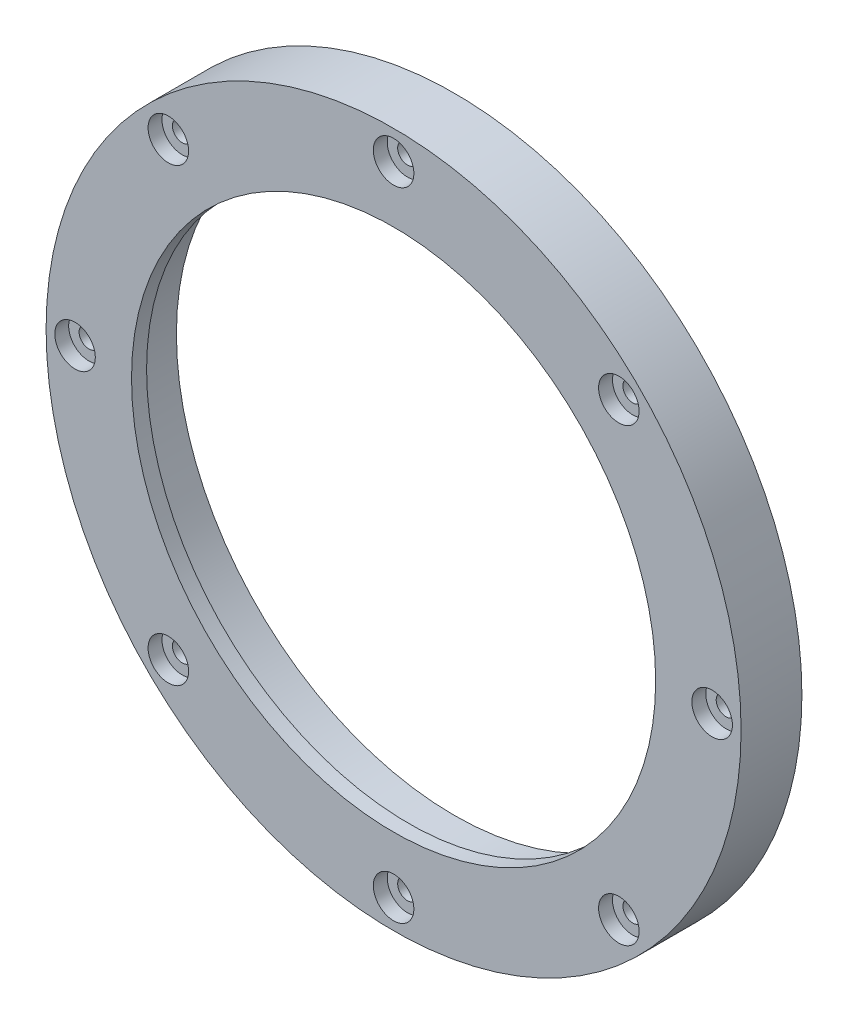
ISO-10303-21;
HEADER;
FILE_DESCRIPTION(('STEP AP214'),'2;1');
FILE_NAME('part.step','',(''),(''),'','','');
FILE_SCHEMA(('AUTOMOTIVE_DESIGN { 1 0 10303 214 1 1 1 1 }'));
ENDSEC;
DATA;
#1=APPLICATION_CONTEXT('core data for automotive mechanical design processes');
#2=APPLICATION_PROTOCOL_DEFINITION('international standard','automotive_design',2000,#1);
#3=PRODUCT_CONTEXT('',#1,'mechanical');
#4=PRODUCT('Part','Part','',(#3));
#5=PRODUCT_RELATED_PRODUCT_CATEGORY('part','',(#4));
#6=PRODUCT_DEFINITION_FORMATION('','',#4);
#7=PRODUCT_DEFINITION_CONTEXT('part definition',#1,'design');
#8=PRODUCT_DEFINITION('design','',#6,#7);
#9=PRODUCT_DEFINITION_SHAPE('','',#8);
#10=(LENGTH_UNIT() NAMED_UNIT(*) SI_UNIT(.MILLI.,.METRE.));
#11=(NAMED_UNIT(*) PLANE_ANGLE_UNIT() SI_UNIT($,.RADIAN.));
#12=(NAMED_UNIT(*) SI_UNIT($,.STERADIAN.) SOLID_ANGLE_UNIT());
#13=UNCERTAINTY_MEASURE_WITH_UNIT(LENGTH_MEASURE(1.E-05),#10,'distance_accuracy_value','');
#14=(GEOMETRIC_REPRESENTATION_CONTEXT(3) GLOBAL_UNCERTAINTY_ASSIGNED_CONTEXT((#13)) GLOBAL_UNIT_ASSIGNED_CONTEXT((#10,
#11,#12)) REPRESENTATION_CONTEXT('',''));
#15=CARTESIAN_POINT('',(0.,0.,0.));
#16=DIRECTION('',(0.,0.,1.));
#17=DIRECTION('',(1.,0.,0.));
#18=AXIS2_PLACEMENT_3D('',#15,#16,#17);
#19=CARTESIAN_POINT('',(0.,0.,70.4));
#20=DIRECTION('',(0.,0.,1.));
#21=DIRECTION('',(1.,0.,0.));
#22=AXIS2_PLACEMENT_3D('',#19,#20,#21);
#23=PLANE('',#22);
#24=CARTESIAN_POINT('',(0.,0.,70.4));
#25=DIRECTION('',(0.,0.,1.));
#26=DIRECTION('',(1.,0.,0.));
#27=AXIS2_PLACEMENT_3D('',#24,#25,#26);
#28=CIRCLE('',#27,48.);
#29=CARTESIAN_POINT('',(48.,0.,70.4));
#30=VERTEX_POINT('',#29);
#31=EDGE_CURVE('E150',#30,#30,#28,.T.);
#32=ORIENTED_EDGE('',*,*,#31,.F.);
#33=EDGE_LOOP('',(#32));
#34=FACE_BOUND('',#33,.T.);
#35=CARTESIAN_POINT('',(0.,0.,70.4));
#36=DIRECTION('',(0.,0.,1.));
#37=DIRECTION('',(1.,0.,0.));
#38=AXIS2_PLACEMENT_3D('',#35,#36,#37);
#39=CIRCLE('',#38,45.25);
#40=CARTESIAN_POINT('',(-45.25,0.,70.4));
#41=VERTEX_POINT('',#40);
#42=EDGE_CURVE('E11',#41,#41,#39,.T.);
#43=ORIENTED_EDGE('',*,*,#42,.T.);
#44=EDGE_LOOP('',(#43));
#45=FACE_BOUND('',#44,.T.);
#46=ADVANCED_FACE('F34',(#34,#45),#23,.F.);
#47=CARTESIAN_POINT('',(0.,0.,73.));
#48=DIRECTION('',(0.,0.,1.));
#49=DIRECTION('',(1.,0.,0.));
#50=AXIS2_PLACEMENT_3D('',#47,#48,#49);
#51=PLANE('',#50);
#52=CARTESIAN_POINT('',(0.,55.,73.));
#53=DIRECTION('',(0.,0.,1.));
#54=DIRECTION('',(1.,0.,0.));
#55=AXIS2_PLACEMENT_3D('',#52,#53,#54);
#56=CIRCLE('',#55,3.5);
#57=CARTESIAN_POINT('',(3.5,55.,73.));
#58=VERTEX_POINT('',#57);
#59=EDGE_CURVE('E285',#58,#58,#56,.T.);
#60=ORIENTED_EDGE('',*,*,#59,.F.);
#61=EDGE_LOOP('',(#60));
#62=FACE_BOUND('',#61,.T.);
#63=CARTESIAN_POINT('',(38.8908729652608,38.8908729652618,73.));
#64=DIRECTION('',(0.,0.,1.));
#65=DIRECTION('',(1.,0.,0.));
#66=AXIS2_PLACEMENT_3D('',#63,#64,#65);
#67=CIRCLE('',#66,3.5);
#68=CARTESIAN_POINT('',(42.3908729652608,38.8908729652618,73.));
#69=VERTEX_POINT('',#68);
#70=EDGE_CURVE('E104',#69,#69,#67,.T.);
#71=ORIENTED_EDGE('',*,*,#70,.F.);
#72=EDGE_LOOP('',(#71));
#73=FACE_BOUND('',#72,.T.);
#74=CARTESIAN_POINT('',(55.0000000000023,2.33468769191537E-12,73.));
#75=DIRECTION('',(0.,0.,1.));
#76=DIRECTION('',(1.,0.,0.));
#77=AXIS2_PLACEMENT_3D('',#74,#75,#76);
#78=CIRCLE('',#77,3.5);
#79=CARTESIAN_POINT('',(58.5000000000023,2.33468769191537E-12,73.));
#80=VERTEX_POINT('',#79);
#81=EDGE_CURVE('E91',#80,#80,#78,.T.);
#82=ORIENTED_EDGE('',*,*,#81,.F.);
#83=EDGE_LOOP('',(#82));
#84=FACE_BOUND('',#83,.T.);
#85=CARTESIAN_POINT('',(38.8908729652641,-38.8908729652585,73.));
#86=DIRECTION('',(0.,0.,1.));
#87=DIRECTION('',(1.,0.,0.));
#88=AXIS2_PLACEMENT_3D('',#85,#86,#87);
#89=CIRCLE('',#88,3.5);
#90=CARTESIAN_POINT('',(42.3908729652641,-38.8908729652585,73.));
#91=VERTEX_POINT('',#90);
#92=EDGE_CURVE('E87',#91,#91,#89,.T.);
#93=ORIENTED_EDGE('',*,*,#92,.F.);
#94=EDGE_LOOP('',(#93));
#95=FACE_BOUND('',#94,.T.);
#96=CARTESIAN_POINT('',(4.66937538383073E-12,-55.,73.));
#97=DIRECTION('',(0.,0.,1.));
#98=DIRECTION('',(1.,0.,0.));
#99=AXIS2_PLACEMENT_3D('',#96,#97,#98);
#100=CIRCLE('',#99,3.5);
#101=CARTESIAN_POINT('',(3.50000000000467,-55.,73.));
#102=VERTEX_POINT('',#101);
#103=EDGE_CURVE('E83',#102,#102,#100,.T.);
#104=ORIENTED_EDGE('',*,*,#103,.F.);
#105=EDGE_LOOP('',(#104));
#106=FACE_BOUND('',#105,.T.);
#107=CARTESIAN_POINT('',(-38.8908729652561,-38.8908729652618,73.));
#108=DIRECTION('',(0.,0.,1.));
#109=DIRECTION('',(1.,0.,0.));
#110=AXIS2_PLACEMENT_3D('',#107,#108,#109);
#111=CIRCLE('',#110,3.5);
#112=CARTESIAN_POINT('',(-35.3908729652561,-38.8908729652618,73.));
#113=VERTEX_POINT('',#112);
#114=EDGE_CURVE('E78',#113,#113,#111,.T.);
#115=ORIENTED_EDGE('',*,*,#114,.F.);
#116=EDGE_LOOP('',(#115));
#117=FACE_BOUND('',#116,.T.);
#118=CARTESIAN_POINT('',(-54.9999999999977,-2.34142324931068E-12,73.));
#119=DIRECTION('',(0.,0.,1.));
#120=DIRECTION('',(1.,0.,0.));
#121=AXIS2_PLACEMENT_3D('',#118,#119,#120);
#122=CIRCLE('',#121,3.5);
#123=CARTESIAN_POINT('',(-51.4999999999977,-2.34142324931068E-12,73.));
#124=VERTEX_POINT('',#123);
#125=EDGE_CURVE('E73',#124,#124,#122,.T.);
#126=ORIENTED_EDGE('',*,*,#125,.F.);
#127=EDGE_LOOP('',(#126));
#128=FACE_BOUND('',#127,.T.);
#129=CARTESIAN_POINT('',(-38.8908729652594,38.8908729652585,73.));
#130=DIRECTION('',(0.,0.,1.));
#131=DIRECTION('',(1.,0.,0.));
#132=AXIS2_PLACEMENT_3D('',#129,#130,#131);
#133=CIRCLE('',#132,3.5);
#134=CARTESIAN_POINT('',(-35.3908729652594,38.8908729652585,73.));
#135=VERTEX_POINT('',#134);
#136=EDGE_CURVE('E68',#135,#135,#133,.T.);
#137=ORIENTED_EDGE('',*,*,#136,.F.);
#138=EDGE_LOOP('',(#137));
#139=FACE_BOUND('',#138,.T.);
#140=CARTESIAN_POINT('',(0.,0.,73.));
#141=DIRECTION('',(0.,0.,1.));
#142=DIRECTION('',(1.,0.,0.));
#143=AXIS2_PLACEMENT_3D('',#140,#141,#142);
#144=CIRCLE('',#143,60.);
#145=CARTESIAN_POINT('',(60.,0.,73.));
#146=VERTEX_POINT('',#145);
#147=EDGE_CURVE('E63',#146,#146,#144,.F.);
#148=ORIENTED_EDGE('',*,*,#147,.F.);
#149=EDGE_LOOP('',(#148));
#150=FACE_BOUND('',#149,.T.);
#151=CARTESIAN_POINT('',(0.,0.,73.));
#152=DIRECTION('',(0.,0.,-1.));
#153=DIRECTION('',(1.,0.,0.));
#154=AXIS2_PLACEMENT_3D('',#151,#152,#153);
#155=CIRCLE('',#154,45.25);
#156=CARTESIAN_POINT('',(-45.25,0.,73.));
#157=VERTEX_POINT('',#156);
#158=EDGE_CURVE('E44',#157,#157,#155,.T.);
#159=ORIENTED_EDGE('',*,*,#158,.T.);
#160=EDGE_LOOP('',(#159));
#161=FACE_BOUND('',#160,.T.);
#162=ADVANCED_FACE('F172',(#62,#73,#84,#95,#106,#117,#128,#139,#150,#161),#51,.T.);
#163=CARTESIAN_POINT('',(0.,0.,70.5));
#164=DIRECTION('',(0.,0.,1.));
#165=DIRECTION('',(1.,0.,0.));
#166=AXIS2_PLACEMENT_3D('',#163,#164,#165);
#167=CYLINDRICAL_SURFACE('',#166,45.25);
#168=ORIENTED_EDGE('',*,*,#42,.F.);
#169=DIRECTION('',(0.,0.,1.));
#170=VECTOR('',#169,1.);
#171=CARTESIAN_POINT('',(-45.25,0.,70.5));
#172=LINE('',#171,#170);
#173=EDGE_CURVE('E53',#41,#157,#172,.T.);
#174=ORIENTED_EDGE('',*,*,#173,.T.);
#175=ORIENTED_EDGE('',*,*,#158,.F.);
#176=ORIENTED_EDGE('',*,*,#173,.F.);
#177=EDGE_LOOP('',(#168,#174,#175,#176));
#178=FACE_BOUND('',#177,.T.);
#179=ADVANCED_FACE('F52',(#178),#167,.F.);
#180=CARTESIAN_POINT('',(0.,0.,62.5));
#181=DIRECTION('',(0.,0.,1.));
#182=DIRECTION('',(1.,0.,0.));
#183=AXIS2_PLACEMENT_3D('',#180,#181,#182);
#184=CYLINDRICAL_SURFACE('',#183,48.);
#185=ORIENTED_EDGE('',*,*,#31,.T.);
#186=EDGE_LOOP('',(#185));
#187=FACE_BOUND('',#186,.T.);
#188=CARTESIAN_POINT('',(0.,0.,62.5));
#189=DIRECTION('',(0.,0.,-1.));
#190=DIRECTION('',(1.,0.,0.));
#191=AXIS2_PLACEMENT_3D('',#188,#189,#190);
#192=CIRCLE('',#191,48.);
#193=CARTESIAN_POINT('',(48.,0.,62.5));
#194=VERTEX_POINT('',#193);
#195=EDGE_CURVE('E56',#194,#194,#192,.T.);
#196=ORIENTED_EDGE('',*,*,#195,.T.);
#197=EDGE_LOOP('',(#196));
#198=FACE_BOUND('',#197,.T.);
#199=ADVANCED_FACE('F36',(#187,#198),#184,.F.);
#200=CARTESIAN_POINT('',(0.,0.,62.5));
#201=DIRECTION('',(0.,0.,1.));
#202=DIRECTION('',(1.,0.,0.));
#203=AXIS2_PLACEMENT_3D('',#200,#201,#202);
#204=PLANE('',#203);
#205=CARTESIAN_POINT('',(0.,55.,62.5));
#206=DIRECTION('',(0.,0.,1.));
#207=DIRECTION('',(1.,0.,0.));
#208=AXIS2_PLACEMENT_3D('',#205,#206,#207);
#209=CIRCLE('',#208,1.69999999999999);
#210=CARTESIAN_POINT('',(1.69999999999999,55.,62.5));
#211=VERTEX_POINT('',#210);
#212=EDGE_CURVE('E38',#211,#211,#209,.T.);
#213=ORIENTED_EDGE('',*,*,#212,.T.);
#214=EDGE_LOOP('',(#213));
#215=FACE_BOUND('',#214,.T.);
#216=CARTESIAN_POINT('',(38.8908729652608,38.8908729652618,62.5));
#217=DIRECTION('',(0.,0.,1.));
#218=DIRECTION('',(1.,0.,0.));
#219=AXIS2_PLACEMENT_3D('',#216,#217,#218);
#220=CIRCLE('',#219,1.69999999999999);
#221=CARTESIAN_POINT('',(40.5908729652608,38.8908729652618,62.5));
#222=VERTEX_POINT('',#221);
#223=EDGE_CURVE('E89',#222,#222,#220,.T.);
#224=ORIENTED_EDGE('',*,*,#223,.T.);
#225=EDGE_LOOP('',(#224));
#226=FACE_BOUND('',#225,.T.);
#227=CARTESIAN_POINT('',(55.0000000000023,2.33468769191537E-12,62.5));
#228=DIRECTION('',(0.,0.,1.));
#229=DIRECTION('',(1.,0.,0.));
#230=AXIS2_PLACEMENT_3D('',#227,#228,#229);
#231=CIRCLE('',#230,1.69999999999999);
#232=CARTESIAN_POINT('',(56.7000000000023,2.33468769191537E-12,62.5));
#233=VERTEX_POINT('',#232);
#234=EDGE_CURVE('E85',#233,#233,#231,.T.);
#235=ORIENTED_EDGE('',*,*,#234,.T.);
#236=EDGE_LOOP('',(#235));
#237=FACE_BOUND('',#236,.T.);
#238=CARTESIAN_POINT('',(38.8908729652641,-38.8908729652585,62.5));
#239=DIRECTION('',(0.,0.,1.));
#240=DIRECTION('',(1.,0.,0.));
#241=AXIS2_PLACEMENT_3D('',#238,#239,#240);
#242=CIRCLE('',#241,1.69999999999999);
#243=CARTESIAN_POINT('',(40.5908729652641,-38.8908729652585,62.5));
#244=VERTEX_POINT('',#243);
#245=EDGE_CURVE('E80',#244,#244,#242,.T.);
#246=ORIENTED_EDGE('',*,*,#245,.T.);
#247=EDGE_LOOP('',(#246));
#248=FACE_BOUND('',#247,.T.);
#249=CARTESIAN_POINT('',(4.66937538383073E-12,-55.,62.5));
#250=DIRECTION('',(0.,0.,1.));
#251=DIRECTION('',(1.,0.,0.));
#252=AXIS2_PLACEMENT_3D('',#249,#250,#251);
#253=CIRCLE('',#252,1.69999999999999);
#254=CARTESIAN_POINT('',(1.70000000000466,-55.,62.5));
#255=VERTEX_POINT('',#254);
#256=EDGE_CURVE('E75',#255,#255,#253,.T.);
#257=ORIENTED_EDGE('',*,*,#256,.T.);
#258=EDGE_LOOP('',(#257));
#259=FACE_BOUND('',#258,.T.);
#260=CARTESIAN_POINT('',(-38.8908729652561,-38.8908729652618,62.5));
#261=DIRECTION('',(0.,0.,1.));
#262=DIRECTION('',(1.,0.,0.));
#263=AXIS2_PLACEMENT_3D('',#260,#261,#262);
#264=CIRCLE('',#263,1.69999999999999);
#265=CARTESIAN_POINT('',(-37.1908729652561,-38.8908729652618,62.5));
#266=VERTEX_POINT('',#265);
#267=EDGE_CURVE('E70',#266,#266,#264,.T.);
#268=ORIENTED_EDGE('',*,*,#267,.T.);
#269=EDGE_LOOP('',(#268));
#270=FACE_BOUND('',#269,.T.);
#271=CARTESIAN_POINT('',(-54.9999999999977,-2.34142324931068E-12,62.5));
#272=DIRECTION('',(0.,0.,1.));
#273=DIRECTION('',(1.,0.,0.));
#274=AXIS2_PLACEMENT_3D('',#271,#272,#273);
#275=CIRCLE('',#274,1.69999999999999);
#276=CARTESIAN_POINT('',(-53.2999999999977,-2.34142324931068E-12,62.5));
#277=VERTEX_POINT('',#276);
#278=EDGE_CURVE('E65',#277,#277,#275,.T.);
#279=ORIENTED_EDGE('',*,*,#278,.T.);
#280=EDGE_LOOP('',(#279));
#281=FACE_BOUND('',#280,.T.);
#282=CARTESIAN_POINT('',(-38.8908729652594,38.8908729652585,62.5));
#283=DIRECTION('',(0.,0.,1.));
#284=DIRECTION('',(1.,0.,0.));
#285=AXIS2_PLACEMENT_3D('',#282,#283,#284);
#286=CIRCLE('',#285,1.69999999999999);
#287=CARTESIAN_POINT('',(-37.1908729652594,38.8908729652585,62.5));
#288=VERTEX_POINT('',#287);
#289=EDGE_CURVE('E60',#288,#288,#286,.T.);
#290=ORIENTED_EDGE('',*,*,#289,.T.);
#291=EDGE_LOOP('',(#290));
#292=FACE_BOUND('',#291,.T.);
#293=ORIENTED_EDGE('',*,*,#195,.F.);
#294=EDGE_LOOP('',(#293));
#295=FACE_BOUND('',#294,.T.);
#296=CARTESIAN_POINT('',(0.,0.,62.5));
#297=DIRECTION('',(0.,0.,-1.));
#298=DIRECTION('',(-1.,0.,0.));
#299=AXIS2_PLACEMENT_3D('',#296,#297,#298);
#300=CIRCLE('',#299,60.);
#301=CARTESIAN_POINT('',(-60.,0.,62.5));
#302=VERTEX_POINT('',#301);
#303=EDGE_CURVE('E147',#302,#302,#300,.T.);
#304=ORIENTED_EDGE('',*,*,#303,.T.);
#305=EDGE_LOOP('',(#304));
#306=FACE_BOUND('',#305,.T.);
#307=ADVANCED_FACE('F158',(#215,#226,#237,#248,#259,#270,#281,#292,#295,#306),#204,.F.);
#308=CARTESIAN_POINT('',(0.,0.,242.705627484771));
#309=DIRECTION('',(0.,0.,-1.));
#310=DIRECTION('',(-1.,0.,0.));
#311=AXIS2_PLACEMENT_3D('',#308,#309,#310);
#312=CYLINDRICAL_SURFACE('',#311,60.);
#313=ORIENTED_EDGE('',*,*,#303,.F.);
#314=EDGE_LOOP('',(#313));
#315=FACE_BOUND('',#314,.T.);
#316=ORIENTED_EDGE('',*,*,#147,.T.);
#317=EDGE_LOOP('',(#316));
#318=FACE_BOUND('',#317,.T.);
#319=ADVANCED_FACE('F161',(#315,#318),#312,.T.);
#320=CARTESIAN_POINT('',(-38.8908729652594,38.8908729652585,73.));
#321=DIRECTION('',(0.,0.,1.));
#322=DIRECTION('',(1.,0.,0.));
#323=AXIS2_PLACEMENT_3D('',#320,#321,#322);
#324=CYLINDRICAL_SURFACE('',#323,1.69999999999999);
#325=CARTESIAN_POINT('',(-38.8908729652594,38.8908729652585,70.6));
#326=DIRECTION('',(0.,0.,1.));
#327=DIRECTION('',(1.,0.,0.));
#328=AXIS2_PLACEMENT_3D('',#325,#326,#327);
#329=CIRCLE('',#328,1.69999999999999);
#330=CARTESIAN_POINT('',(-37.1908729652594,38.8908729652585,70.6));
#331=VERTEX_POINT('',#330);
#332=EDGE_CURVE('E64',#331,#331,#329,.T.);
#333=ORIENTED_EDGE('',*,*,#332,.T.);
#334=EDGE_LOOP('',(#333));
#335=FACE_BOUND('',#334,.T.);
#336=ORIENTED_EDGE('',*,*,#289,.F.);
#337=EDGE_LOOP('',(#336));
#338=FACE_BOUND('',#337,.T.);
#339=ADVANCED_FACE('F168',(#335,#338),#324,.F.);
#340=CARTESIAN_POINT('',(-37.1908729652594,38.8908729652585,70.6));
#341=DIRECTION('',(0.,0.,-1.));
#342=DIRECTION('',(-1.,0.,0.));
#343=AXIS2_PLACEMENT_3D('',#340,#341,#342);
#344=PLANE('',#343);
#345=ORIENTED_EDGE('',*,*,#332,.F.);
#346=EDGE_LOOP('',(#345));
#347=FACE_BOUND('',#346,.T.);
#348=CARTESIAN_POINT('',(-38.8908729652594,38.8908729652585,70.6));
#349=DIRECTION('',(0.,0.,1.));
#350=DIRECTION('',(1.,0.,0.));
#351=AXIS2_PLACEMENT_3D('',#348,#349,#350);
#352=CIRCLE('',#351,3.5);
#353=CARTESIAN_POINT('',(-35.3908729652594,38.8908729652585,70.6));
#354=VERTEX_POINT('',#353);
#355=EDGE_CURVE('E142',#354,#354,#352,.T.);
#356=ORIENTED_EDGE('',*,*,#355,.T.);
#357=EDGE_LOOP('',(#356));
#358=FACE_BOUND('',#357,.T.);
#359=ADVANCED_FACE('F187',(#347,#358),#344,.F.);
#360=CARTESIAN_POINT('',(-38.8908729652594,38.8908729652585,73.));
#361=DIRECTION('',(0.,0.,1.));
#362=DIRECTION('',(1.,0.,0.));
#363=AXIS2_PLACEMENT_3D('',#360,#361,#362);
#364=CYLINDRICAL_SURFACE('',#363,3.5);
#365=ORIENTED_EDGE('',*,*,#355,.F.);
#366=EDGE_LOOP('',(#365));
#367=FACE_BOUND('',#366,.T.);
#368=ORIENTED_EDGE('',*,*,#136,.T.);
#369=EDGE_LOOP('',(#368));
#370=FACE_BOUND('',#369,.T.);
#371=ADVANCED_FACE('F191',(#367,#370),#364,.F.);
#372=CARTESIAN_POINT('',(-54.9999999999977,-2.34142324931068E-12,73.));
#373=DIRECTION('',(0.,0.,1.));
#374=DIRECTION('',(1.,0.,0.));
#375=AXIS2_PLACEMENT_3D('',#372,#373,#374);
#376=CYLINDRICAL_SURFACE('',#375,1.69999999999999);
#377=CARTESIAN_POINT('',(-54.9999999999977,-2.34142324931068E-12,70.6));
#378=DIRECTION('',(0.,0.,1.));
#379=DIRECTION('',(1.,0.,0.));
#380=AXIS2_PLACEMENT_3D('',#377,#378,#379);
#381=CIRCLE('',#380,1.69999999999999);
#382=CARTESIAN_POINT('',(-53.2999999999977,-2.34142324931068E-12,70.6));
#383=VERTEX_POINT('',#382);
#384=EDGE_CURVE('E69',#383,#383,#381,.T.);
#385=ORIENTED_EDGE('',*,*,#384,.T.);
#386=EDGE_LOOP('',(#385));
#387=FACE_BOUND('',#386,.T.);
#388=ORIENTED_EDGE('',*,*,#278,.F.);
#389=EDGE_LOOP('',(#388));
#390=FACE_BOUND('',#389,.T.);
#391=ADVANCED_FACE('F195',(#387,#390),#376,.F.);
#392=CARTESIAN_POINT('',(-53.2999999999977,-2.34142324931068E-12,70.6));
#393=DIRECTION('',(0.,0.,-1.));
#394=DIRECTION('',(-1.,0.,0.));
#395=AXIS2_PLACEMENT_3D('',#392,#393,#394);
#396=PLANE('',#395);
#397=ORIENTED_EDGE('',*,*,#384,.F.);
#398=EDGE_LOOP('',(#397));
#399=FACE_BOUND('',#398,.T.);
#400=CARTESIAN_POINT('',(-54.9999999999977,-2.34142324931068E-12,70.6));
#401=DIRECTION('',(0.,0.,1.));
#402=DIRECTION('',(1.,0.,0.));
#403=AXIS2_PLACEMENT_3D('',#400,#401,#402);
#404=CIRCLE('',#403,3.5);
#405=CARTESIAN_POINT('',(-51.4999999999977,-2.34142324931068E-12,70.6));
#406=VERTEX_POINT('',#405);
#407=EDGE_CURVE('E135',#406,#406,#404,.T.);
#408=ORIENTED_EDGE('',*,*,#407,.T.);
#409=EDGE_LOOP('',(#408));
#410=FACE_BOUND('',#409,.T.);
#411=ADVANCED_FACE('F199',(#399,#410),#396,.F.);
#412=CARTESIAN_POINT('',(-54.9999999999977,-2.34142324931068E-12,73.));
#413=DIRECTION('',(0.,0.,1.));
#414=DIRECTION('',(1.,0.,0.));
#415=AXIS2_PLACEMENT_3D('',#412,#413,#414);
#416=CYLINDRICAL_SURFACE('',#415,3.5);
#417=ORIENTED_EDGE('',*,*,#407,.F.);
#418=EDGE_LOOP('',(#417));
#419=FACE_BOUND('',#418,.T.);
#420=ORIENTED_EDGE('',*,*,#125,.T.);
#421=EDGE_LOOP('',(#420));
#422=FACE_BOUND('',#421,.T.);
#423=ADVANCED_FACE('F203',(#419,#422),#416,.F.);
#424=CARTESIAN_POINT('',(-38.8908729652561,-38.8908729652618,73.));
#425=DIRECTION('',(0.,0.,1.));
#426=DIRECTION('',(1.,0.,0.));
#427=AXIS2_PLACEMENT_3D('',#424,#425,#426);
#428=CYLINDRICAL_SURFACE('',#427,1.69999999999999);
#429=CARTESIAN_POINT('',(-38.8908729652561,-38.8908729652618,70.6));
#430=DIRECTION('',(0.,0.,1.));
#431=DIRECTION('',(1.,0.,0.));
#432=AXIS2_PLACEMENT_3D('',#429,#430,#431);
#433=CIRCLE('',#432,1.69999999999999);
#434=CARTESIAN_POINT('',(-37.1908729652561,-38.8908729652618,70.6));
#435=VERTEX_POINT('',#434);
#436=EDGE_CURVE('E74',#435,#435,#433,.T.);
#437=ORIENTED_EDGE('',*,*,#436,.T.);
#438=EDGE_LOOP('',(#437));
#439=FACE_BOUND('',#438,.T.);
#440=ORIENTED_EDGE('',*,*,#267,.F.);
#441=EDGE_LOOP('',(#440));
#442=FACE_BOUND('',#441,.T.);
#443=ADVANCED_FACE('F207',(#439,#442),#428,.F.);
#444=CARTESIAN_POINT('',(-37.1908729652561,-38.8908729652618,70.6));
#445=DIRECTION('',(0.,0.,-1.));
#446=DIRECTION('',(-1.,0.,0.));
#447=AXIS2_PLACEMENT_3D('',#444,#445,#446);
#448=PLANE('',#447);
#449=ORIENTED_EDGE('',*,*,#436,.F.);
#450=EDGE_LOOP('',(#449));
#451=FACE_BOUND('',#450,.T.);
#452=CARTESIAN_POINT('',(-38.8908729652561,-38.8908729652618,70.6));
#453=DIRECTION('',(0.,0.,1.));
#454=DIRECTION('',(1.,0.,0.));
#455=AXIS2_PLACEMENT_3D('',#452,#453,#454);
#456=CIRCLE('',#455,3.5);
#457=CARTESIAN_POINT('',(-35.3908729652561,-38.8908729652618,70.6));
#458=VERTEX_POINT('',#457);
#459=EDGE_CURVE('E128',#458,#458,#456,.T.);
#460=ORIENTED_EDGE('',*,*,#459,.T.);
#461=EDGE_LOOP('',(#460));
#462=FACE_BOUND('',#461,.T.);
#463=ADVANCED_FACE('F211',(#451,#462),#448,.F.);
#464=CARTESIAN_POINT('',(-38.8908729652561,-38.8908729652618,73.));
#465=DIRECTION('',(0.,0.,1.));
#466=DIRECTION('',(1.,0.,0.));
#467=AXIS2_PLACEMENT_3D('',#464,#465,#466);
#468=CYLINDRICAL_SURFACE('',#467,3.5);
#469=ORIENTED_EDGE('',*,*,#459,.F.);
#470=EDGE_LOOP('',(#469));
#471=FACE_BOUND('',#470,.T.);
#472=ORIENTED_EDGE('',*,*,#114,.T.);
#473=EDGE_LOOP('',(#472));
#474=FACE_BOUND('',#473,.T.);
#475=ADVANCED_FACE('F215',(#471,#474),#468,.F.);
#476=CARTESIAN_POINT('',(4.66937538383073E-12,-55.,73.));
#477=DIRECTION('',(0.,0.,1.));
#478=DIRECTION('',(1.,0.,0.));
#479=AXIS2_PLACEMENT_3D('',#476,#477,#478);
#480=CYLINDRICAL_SURFACE('',#479,1.69999999999999);
#481=CARTESIAN_POINT('',(4.66937538383073E-12,-55.,70.6));
#482=DIRECTION('',(0.,0.,1.));
#483=DIRECTION('',(1.,0.,0.));
#484=AXIS2_PLACEMENT_3D('',#481,#482,#483);
#485=CIRCLE('',#484,1.69999999999999);
#486=CARTESIAN_POINT('',(1.70000000000466,-55.,70.6));
#487=VERTEX_POINT('',#486);
#488=EDGE_CURVE('E79',#487,#487,#485,.T.);
#489=ORIENTED_EDGE('',*,*,#488,.T.);
#490=EDGE_LOOP('',(#489));
#491=FACE_BOUND('',#490,.T.);
#492=ORIENTED_EDGE('',*,*,#256,.F.);
#493=EDGE_LOOP('',(#492));
#494=FACE_BOUND('',#493,.T.);
#495=ADVANCED_FACE('F219',(#491,#494),#480,.F.);
#496=CARTESIAN_POINT('',(1.70000000000466,-55.,70.6));
#497=DIRECTION('',(0.,0.,-1.));
#498=DIRECTION('',(-1.,0.,0.));
#499=AXIS2_PLACEMENT_3D('',#496,#497,#498);
#500=PLANE('',#499);
#501=ORIENTED_EDGE('',*,*,#488,.F.);
#502=EDGE_LOOP('',(#501));
#503=FACE_BOUND('',#502,.T.);
#504=CARTESIAN_POINT('',(4.66937538383073E-12,-55.,70.6));
#505=DIRECTION('',(0.,0.,1.));
#506=DIRECTION('',(1.,0.,0.));
#507=AXIS2_PLACEMENT_3D('',#504,#505,#506);
#508=CIRCLE('',#507,3.5);
#509=CARTESIAN_POINT('',(3.50000000000467,-55.,70.6));
#510=VERTEX_POINT('',#509);
#511=EDGE_CURVE('E121',#510,#510,#508,.T.);
#512=ORIENTED_EDGE('',*,*,#511,.T.);
#513=EDGE_LOOP('',(#512));
#514=FACE_BOUND('',#513,.T.);
#515=ADVANCED_FACE('F223',(#503,#514),#500,.F.);
#516=CARTESIAN_POINT('',(4.66937538383073E-12,-55.,73.));
#517=DIRECTION('',(0.,0.,1.));
#518=DIRECTION('',(1.,0.,0.));
#519=AXIS2_PLACEMENT_3D('',#516,#517,#518);
#520=CYLINDRICAL_SURFACE('',#519,3.5);
#521=ORIENTED_EDGE('',*,*,#511,.F.);
#522=EDGE_LOOP('',(#521));
#523=FACE_BOUND('',#522,.T.);
#524=ORIENTED_EDGE('',*,*,#103,.T.);
#525=EDGE_LOOP('',(#524));
#526=FACE_BOUND('',#525,.T.);
#527=ADVANCED_FACE('F227',(#523,#526),#520,.F.);
#528=CARTESIAN_POINT('',(38.8908729652641,-38.8908729652585,73.));
#529=DIRECTION('',(0.,0.,1.));
#530=DIRECTION('',(1.,0.,0.));
#531=AXIS2_PLACEMENT_3D('',#528,#529,#530);
#532=CYLINDRICAL_SURFACE('',#531,1.69999999999999);
#533=CARTESIAN_POINT('',(38.8908729652641,-38.8908729652585,70.6));
#534=DIRECTION('',(0.,0.,1.));
#535=DIRECTION('',(1.,0.,0.));
#536=AXIS2_PLACEMENT_3D('',#533,#534,#535);
#537=CIRCLE('',#536,1.69999999999999);
#538=CARTESIAN_POINT('',(40.5908729652641,-38.8908729652585,70.6));
#539=VERTEX_POINT('',#538);
#540=EDGE_CURVE('E84',#539,#539,#537,.T.);
#541=ORIENTED_EDGE('',*,*,#540,.T.);
#542=EDGE_LOOP('',(#541));
#543=FACE_BOUND('',#542,.T.);
#544=ORIENTED_EDGE('',*,*,#245,.F.);
#545=EDGE_LOOP('',(#544));
#546=FACE_BOUND('',#545,.T.);
#547=ADVANCED_FACE('F231',(#543,#546),#532,.F.);
#548=CARTESIAN_POINT('',(40.5908729652641,-38.8908729652585,70.6));
#549=DIRECTION('',(0.,0.,-1.));
#550=DIRECTION('',(-1.,0.,0.));
#551=AXIS2_PLACEMENT_3D('',#548,#549,#550);
#552=PLANE('',#551);
#553=ORIENTED_EDGE('',*,*,#540,.F.);
#554=EDGE_LOOP('',(#553));
#555=FACE_BOUND('',#554,.T.);
#556=CARTESIAN_POINT('',(38.8908729652641,-38.8908729652585,70.6));
#557=DIRECTION('',(0.,0.,1.));
#558=DIRECTION('',(1.,0.,0.));
#559=AXIS2_PLACEMENT_3D('',#556,#557,#558);
#560=CIRCLE('',#559,3.5);
#561=CARTESIAN_POINT('',(42.3908729652641,-38.8908729652585,70.6));
#562=VERTEX_POINT('',#561);
#563=EDGE_CURVE('E114',#562,#562,#560,.T.);
#564=ORIENTED_EDGE('',*,*,#563,.T.);
#565=EDGE_LOOP('',(#564));
#566=FACE_BOUND('',#565,.T.);
#567=ADVANCED_FACE('F235',(#555,#566),#552,.F.);
#568=CARTESIAN_POINT('',(38.8908729652641,-38.8908729652585,73.));
#569=DIRECTION('',(0.,0.,1.));
#570=DIRECTION('',(1.,0.,0.));
#571=AXIS2_PLACEMENT_3D('',#568,#569,#570);
#572=CYLINDRICAL_SURFACE('',#571,3.5);
#573=ORIENTED_EDGE('',*,*,#563,.F.);
#574=EDGE_LOOP('',(#573));
#575=FACE_BOUND('',#574,.T.);
#576=ORIENTED_EDGE('',*,*,#92,.T.);
#577=EDGE_LOOP('',(#576));
#578=FACE_BOUND('',#577,.T.);
#579=ADVANCED_FACE('F239',(#575,#578),#572,.F.);
#580=CARTESIAN_POINT('',(55.0000000000023,2.33468769191537E-12,73.));
#581=DIRECTION('',(0.,0.,1.));
#582=DIRECTION('',(1.,0.,0.));
#583=AXIS2_PLACEMENT_3D('',#580,#581,#582);
#584=CYLINDRICAL_SURFACE('',#583,1.69999999999999);
#585=CARTESIAN_POINT('',(55.0000000000023,2.33468769191537E-12,70.6));
#586=DIRECTION('',(0.,0.,1.));
#587=DIRECTION('',(1.,0.,0.));
#588=AXIS2_PLACEMENT_3D('',#585,#586,#587);
#589=CIRCLE('',#588,1.69999999999999);
#590=CARTESIAN_POINT('',(56.7000000000023,2.33468769191537E-12,70.6));
#591=VERTEX_POINT('',#590);
#592=EDGE_CURVE('E88',#591,#591,#589,.T.);
#593=ORIENTED_EDGE('',*,*,#592,.T.);
#594=EDGE_LOOP('',(#593));
#595=FACE_BOUND('',#594,.T.);
#596=ORIENTED_EDGE('',*,*,#234,.F.);
#597=EDGE_LOOP('',(#596));
#598=FACE_BOUND('',#597,.T.);
#599=ADVANCED_FACE('F243',(#595,#598),#584,.F.);
#600=CARTESIAN_POINT('',(56.7000000000023,2.33468769191537E-12,70.6));
#601=DIRECTION('',(0.,0.,-1.));
#602=DIRECTION('',(-1.,0.,0.));
#603=AXIS2_PLACEMENT_3D('',#600,#601,#602);
#604=PLANE('',#603);
#605=ORIENTED_EDGE('',*,*,#592,.F.);
#606=EDGE_LOOP('',(#605));
#607=FACE_BOUND('',#606,.T.);
#608=CARTESIAN_POINT('',(55.0000000000023,2.33468769191537E-12,70.6));
#609=DIRECTION('',(0.,0.,1.));
#610=DIRECTION('',(1.,0.,0.));
#611=AXIS2_PLACEMENT_3D('',#608,#609,#610);
#612=CIRCLE('',#611,3.5);
#613=CARTESIAN_POINT('',(58.5000000000023,2.33468769191537E-12,70.6));
#614=VERTEX_POINT('',#613);
#615=EDGE_CURVE('E96',#614,#614,#612,.T.);
#616=ORIENTED_EDGE('',*,*,#615,.T.);
#617=EDGE_LOOP('',(#616));
#618=FACE_BOUND('',#617,.T.);
#619=ADVANCED_FACE('F247',(#607,#618),#604,.F.);
#620=CARTESIAN_POINT('',(55.0000000000023,2.33468769191537E-12,73.));
#621=DIRECTION('',(0.,0.,1.));
#622=DIRECTION('',(1.,0.,0.));
#623=AXIS2_PLACEMENT_3D('',#620,#621,#622);
#624=CYLINDRICAL_SURFACE('',#623,3.5);
#625=ORIENTED_EDGE('',*,*,#615,.F.);
#626=EDGE_LOOP('',(#625));
#627=FACE_BOUND('',#626,.T.);
#628=ORIENTED_EDGE('',*,*,#81,.T.);
#629=EDGE_LOOP('',(#628));
#630=FACE_BOUND('',#629,.T.);
#631=ADVANCED_FACE('F251',(#627,#630),#624,.F.);
#632=CARTESIAN_POINT('',(38.8908729652608,38.8908729652618,73.));
#633=DIRECTION('',(0.,0.,1.));
#634=DIRECTION('',(1.,0.,0.));
#635=AXIS2_PLACEMENT_3D('',#632,#633,#634);
#636=CYLINDRICAL_SURFACE('',#635,1.69999999999999);
#637=CARTESIAN_POINT('',(38.8908729652608,38.8908729652618,70.6));
#638=DIRECTION('',(0.,0.,1.));
#639=DIRECTION('',(1.,0.,0.));
#640=AXIS2_PLACEMENT_3D('',#637,#638,#639);
#641=CIRCLE('',#640,1.69999999999999);
#642=CARTESIAN_POINT('',(40.5908729652608,38.8908729652618,70.6));
#643=VERTEX_POINT('',#642);
#644=EDGE_CURVE('E92',#643,#643,#641,.T.);
#645=ORIENTED_EDGE('',*,*,#644,.T.);
#646=EDGE_LOOP('',(#645));
#647=FACE_BOUND('',#646,.T.);
#648=ORIENTED_EDGE('',*,*,#223,.F.);
#649=EDGE_LOOP('',(#648));
#650=FACE_BOUND('',#649,.T.);
#651=ADVANCED_FACE('F255',(#647,#650),#636,.F.);
#652=CARTESIAN_POINT('',(40.5908729652608,38.8908729652618,70.6));
#653=DIRECTION('',(0.,0.,-1.));
#654=DIRECTION('',(-1.,0.,0.));
#655=AXIS2_PLACEMENT_3D('',#652,#653,#654);
#656=PLANE('',#655);
#657=ORIENTED_EDGE('',*,*,#644,.F.);
#658=EDGE_LOOP('',(#657));
#659=FACE_BOUND('',#658,.T.);
#660=CARTESIAN_POINT('',(38.8908729652608,38.8908729652618,70.6));
#661=DIRECTION('',(0.,0.,1.));
#662=DIRECTION('',(1.,0.,0.));
#663=AXIS2_PLACEMENT_3D('',#660,#661,#662);
#664=CIRCLE('',#663,3.5);
#665=CARTESIAN_POINT('',(42.3908729652608,38.8908729652618,70.6));
#666=VERTEX_POINT('',#665);
#667=EDGE_CURVE('E99',#666,#666,#664,.T.);
#668=ORIENTED_EDGE('',*,*,#667,.T.);
#669=EDGE_LOOP('',(#668));
#670=FACE_BOUND('',#669,.T.);
#671=ADVANCED_FACE('F259',(#659,#670),#656,.F.);
#672=CARTESIAN_POINT('',(38.8908729652608,38.8908729652618,73.));
#673=DIRECTION('',(0.,0.,1.));
#674=DIRECTION('',(1.,0.,0.));
#675=AXIS2_PLACEMENT_3D('',#672,#673,#674);
#676=CYLINDRICAL_SURFACE('',#675,3.5);
#677=ORIENTED_EDGE('',*,*,#667,.F.);
#678=EDGE_LOOP('',(#677));
#679=FACE_BOUND('',#678,.T.);
#680=ORIENTED_EDGE('',*,*,#70,.T.);
#681=EDGE_LOOP('',(#680));
#682=FACE_BOUND('',#681,.T.);
#683=ADVANCED_FACE('F262',(#679,#682),#676,.F.);
#684=CARTESIAN_POINT('',(0.,55.,73.));
#685=DIRECTION('',(0.,0.,1.));
#686=DIRECTION('',(1.,0.,0.));
#687=AXIS2_PLACEMENT_3D('',#684,#685,#686);
#688=CYLINDRICAL_SURFACE('',#687,1.69999999999999);
#689=CARTESIAN_POINT('',(0.,55.,70.6));
#690=DIRECTION('',(0.,0.,1.));
#691=DIRECTION('',(1.,0.,0.));
#692=AXIS2_PLACEMENT_3D('',#689,#690,#691);
#693=CIRCLE('',#692,1.69999999999999);
#694=CARTESIAN_POINT('',(1.69999999999999,55.,70.6));
#695=VERTEX_POINT('',#694);
#696=EDGE_CURVE('E287',#695,#695,#693,.T.);
#697=ORIENTED_EDGE('',*,*,#696,.T.);
#698=EDGE_LOOP('',(#697));
#699=FACE_BOUND('',#698,.T.);
#700=ORIENTED_EDGE('',*,*,#212,.F.);
#701=EDGE_LOOP('',(#700));
#702=FACE_BOUND('',#701,.T.);
#703=ADVANCED_FACE('F266',(#699,#702),#688,.F.);
#704=CARTESIAN_POINT('',(1.69999999999999,55.,70.6));
#705=DIRECTION('',(0.,0.,-1.));
#706=DIRECTION('',(-1.,0.,0.));
#707=AXIS2_PLACEMENT_3D('',#704,#705,#706);
#708=PLANE('',#707);
#709=ORIENTED_EDGE('',*,*,#696,.F.);
#710=EDGE_LOOP('',(#709));
#711=FACE_BOUND('',#710,.T.);
#712=CARTESIAN_POINT('',(0.,55.,70.6));
#713=DIRECTION('',(0.,0.,1.));
#714=DIRECTION('',(1.,0.,0.));
#715=AXIS2_PLACEMENT_3D('',#712,#713,#714);
#716=CIRCLE('',#715,3.5);
#717=CARTESIAN_POINT('',(3.5,55.,70.6));
#718=VERTEX_POINT('',#717);
#719=EDGE_CURVE('E283',#718,#718,#716,.T.);
#720=ORIENTED_EDGE('',*,*,#719,.T.);
#721=EDGE_LOOP('',(#720));
#722=FACE_BOUND('',#721,.T.);
#723=ADVANCED_FACE('F270',(#711,#722),#708,.F.);
#724=CARTESIAN_POINT('',(0.,55.,73.));
#725=DIRECTION('',(0.,0.,1.));
#726=DIRECTION('',(1.,0.,0.));
#727=AXIS2_PLACEMENT_3D('',#724,#725,#726);
#728=CYLINDRICAL_SURFACE('',#727,3.5);
#729=ORIENTED_EDGE('',*,*,#719,.F.);
#730=EDGE_LOOP('',(#729));
#731=FACE_BOUND('',#730,.T.);
#732=ORIENTED_EDGE('',*,*,#59,.T.);
#733=EDGE_LOOP('',(#732));
#734=FACE_BOUND('',#733,.T.);
#735=ADVANCED_FACE('F274',(#731,#734),#728,.F.);
#736=CLOSED_SHELL('',(#46,#162,#179,#199,#307,#319,#339,#359,#371,#391,#411,#423,#443,#463,#475,
#495,#515,#527,#547,#567,#579,#599,#619,#631,#651,#671,#683,#703,#723,#735));
#737=MANIFOLD_SOLID_BREP('B2',#736);
#738=ADVANCED_BREP_SHAPE_REPRESENTATION('',(#18,#737),#14);
#739=SHAPE_DEFINITION_REPRESENTATION(#9,#738);
ENDSEC;
END-ISO-10303-21;
